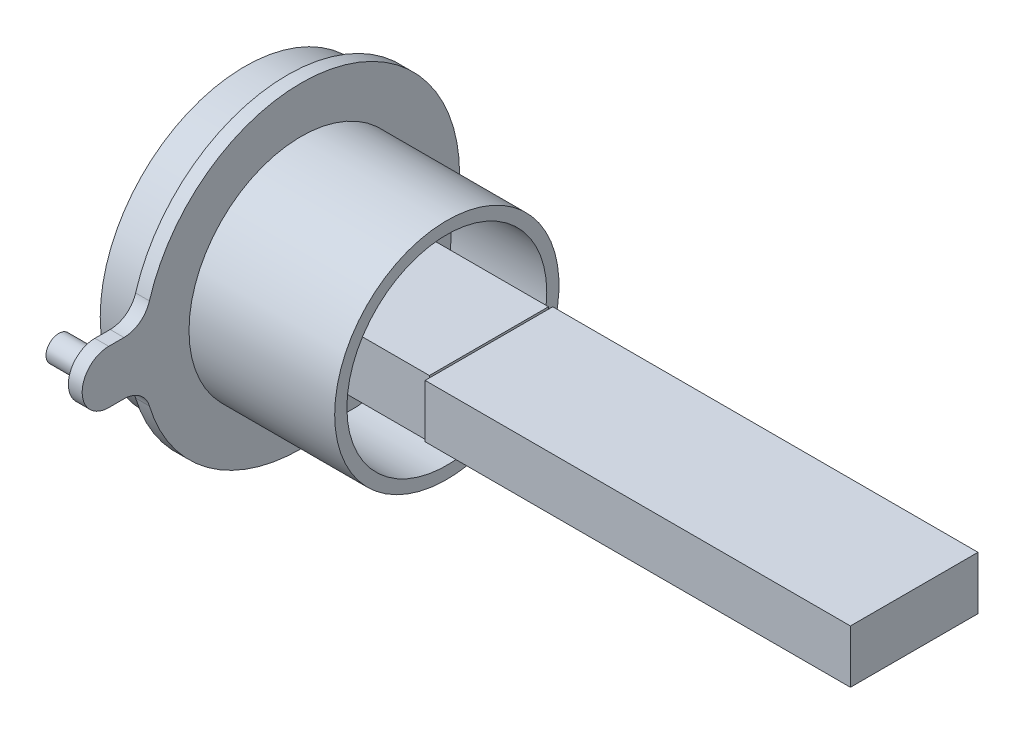
ISO-10303-21;
HEADER;
FILE_DESCRIPTION(('STEP AP214'),'2;1');
FILE_NAME('part.step','',(''),(''),'','','');
FILE_SCHEMA(('AUTOMOTIVE_DESIGN { 1 0 10303 214 1 1 1 1 }'));
ENDSEC;
DATA;
#1=APPLICATION_CONTEXT('core data for automotive mechanical design processes');
#2=APPLICATION_PROTOCOL_DEFINITION('international standard','automotive_design',2000,#1);
#3=PRODUCT_CONTEXT('',#1,'mechanical');
#4=PRODUCT('Part','Part','',(#3));
#5=PRODUCT_RELATED_PRODUCT_CATEGORY('part','',(#4));
#6=PRODUCT_DEFINITION_FORMATION('','',#4);
#7=PRODUCT_DEFINITION_CONTEXT('part definition',#1,'design');
#8=PRODUCT_DEFINITION('design','',#6,#7);
#9=PRODUCT_DEFINITION_SHAPE('','',#8);
#10=(LENGTH_UNIT() NAMED_UNIT(*) SI_UNIT(.MILLI.,.METRE.));
#11=(NAMED_UNIT(*) PLANE_ANGLE_UNIT() SI_UNIT($,.RADIAN.));
#12=(NAMED_UNIT(*) SI_UNIT($,.STERADIAN.) SOLID_ANGLE_UNIT());
#13=UNCERTAINTY_MEASURE_WITH_UNIT(LENGTH_MEASURE(1.E-05),#10,'distance_accuracy_value','');
#14=(GEOMETRIC_REPRESENTATION_CONTEXT(3) GLOBAL_UNCERTAINTY_ASSIGNED_CONTEXT((#13)) GLOBAL_UNIT_ASSIGNED_CONTEXT((#10,
#11,#12)) REPRESENTATION_CONTEXT('',''));
#15=CARTESIAN_POINT('',(0.,0.,0.));
#16=DIRECTION('',(0.,0.,1.));
#17=DIRECTION('',(1.,0.,0.));
#18=AXIS2_PLACEMENT_3D('',#15,#16,#17);
#19=CARTESIAN_POINT('',(22.4282,3.429,7.112));
#20=DIRECTION('',(-1.,0.,0.));
#21=DIRECTION('',(0.,0.,1.));
#22=AXIS2_PLACEMENT_3D('',#19,#20,#21);
#23=PLANE('',#22);
#24=DIRECTION('',(0.,0.,1.));
#25=VECTOR('',#24,1.);
#26=CARTESIAN_POINT('',(22.4282,3.175,7.62));
#27=LINE('',#26,#25);
#28=CARTESIAN_POINT('',(22.4282,3.175,-7.112));
#29=VERTEX_POINT('',#28);
#30=CARTESIAN_POINT('',(22.4282,3.175,7.112));
#31=VERTEX_POINT('',#30);
#32=EDGE_CURVE('E11',#29,#31,#27,.T.);
#33=ORIENTED_EDGE('',*,*,#32,.F.);
#34=DIRECTION('',(0.,1.,0.));
#35=VECTOR('',#34,1.);
#36=CARTESIAN_POINT('',(22.4282,3.429,-7.112));
#37=LINE('',#36,#35);
#38=CARTESIAN_POINT('',(22.4282,3.429,-7.112));
#39=VERTEX_POINT('',#38);
#40=EDGE_CURVE('E234',#29,#39,#37,.T.);
#41=ORIENTED_EDGE('',*,*,#40,.T.);
#42=DIRECTION('',(0.,0.,1.));
#43=VECTOR('',#42,1.);
#44=CARTESIAN_POINT('',(22.4282,3.429,7.112));
#45=LINE('',#44,#43);
#46=CARTESIAN_POINT('',(22.4282,3.429,7.112));
#47=VERTEX_POINT('',#46);
#48=EDGE_CURVE('E237',#39,#47,#45,.T.);
#49=ORIENTED_EDGE('',*,*,#48,.T.);
#50=DIRECTION('',(0.,-1.,0.));
#51=VECTOR('',#50,1.);
#52=CARTESIAN_POINT('',(22.4282,-3.429,7.112));
#53=LINE('',#52,#51);
#54=EDGE_CURVE('E228',#47,#31,#53,.T.);
#55=ORIENTED_EDGE('',*,*,#54,.T.);
#56=EDGE_LOOP('',(#33,#41,#49,#55));
#57=FACE_BOUND('',#56,.T.);
#58=ADVANCED_FACE('F34',(#57),#23,.F.);
#59=DIRECTION('',(0.,0.,-1.));
#60=VECTOR('',#59,1.);
#61=CARTESIAN_POINT('',(22.4282,-3.175,-7.62));
#62=LINE('',#61,#60);
#63=CARTESIAN_POINT('',(22.4282,-3.175,7.112));
#64=VERTEX_POINT('',#63);
#65=CARTESIAN_POINT('',(22.4282,-3.175,-7.112));
#66=VERTEX_POINT('',#65);
#67=EDGE_CURVE('E43',#64,#66,#62,.T.);
#68=ORIENTED_EDGE('',*,*,#67,.F.);
#69=CARTESIAN_POINT('',(22.4282,-3.429,7.112));
#70=VERTEX_POINT('',#69);
#71=EDGE_CURVE('E232',#64,#70,#53,.T.);
#72=ORIENTED_EDGE('',*,*,#71,.T.);
#73=DIRECTION('',(0.,0.,-1.));
#74=VECTOR('',#73,1.);
#75=CARTESIAN_POINT('',(22.4282,-3.429,-7.112));
#76=LINE('',#75,#74);
#77=CARTESIAN_POINT('',(22.4282,-3.429,-7.112));
#78=VERTEX_POINT('',#77);
#79=EDGE_CURVE('E230',#70,#78,#76,.T.);
#80=ORIENTED_EDGE('',*,*,#79,.T.);
#81=EDGE_CURVE('E235',#78,#66,#37,.T.);
#82=ORIENTED_EDGE('',*,*,#81,.T.);
#83=EDGE_LOOP('',(#68,#72,#80,#82));
#84=FACE_BOUND('',#83,.T.);
#85=ADVANCED_FACE('F389',(#84),#23,.F.);
#86=CARTESIAN_POINT('',(-1.651,18.923,0.));
#87=DIRECTION('',(1.,0.,0.));
#88=DIRECTION('',(0.,0.,-1.));
#89=AXIS2_PLACEMENT_3D('',#86,#87,#88);
#90=PLANE('',#89);
#91=DIRECTION('',(0.,0.,-1.));
#92=VECTOR('',#91,1.);
#93=CARTESIAN_POINT('',(-1.651,3.175,22.987));
#94=LINE('',#93,#92);
#95=CARTESIAN_POINT('',(-1.651,3.175,22.987));
#96=VERTEX_POINT('',#95);
#97=CARTESIAN_POINT('',(-1.651,3.175,21.1659893224957));
#98=VERTEX_POINT('',#97);
#99=EDGE_CURVE('E207',#96,#98,#94,.T.);
#100=ORIENTED_EDGE('',*,*,#99,.T.);
#101=CARTESIAN_POINT('',(-1.651,6.35,21.1659893224957));
#102=DIRECTION('',(1.,0.,0.));
#103=DIRECTION('',(0.,0.,-1.));
#104=AXIS2_PLACEMENT_3D('',#101,#102,#103);
#105=CIRCLE('',#104,3.175);
#106=CARTESIAN_POINT('',(-1.651,5.43764367816092,18.1248989025969));
#107=VERTEX_POINT('',#106);
#108=EDGE_CURVE('E336',#98,#107,#105,.T.);
#109=ORIENTED_EDGE('',*,*,#108,.T.);
#110=CARTESIAN_POINT('',(-1.651,0.,0.));
#111=DIRECTION('',(-1.,0.,0.));
#112=DIRECTION('',(0.,0.,1.));
#113=AXIS2_PLACEMENT_3D('',#110,#111,#112);
#114=CIRCLE('',#113,18.923);
#115=CARTESIAN_POINT('',(-1.651,-5.43764367816092,18.1248989025969));
#116=VERTEX_POINT('',#115);
#117=EDGE_CURVE('E320',#107,#116,#114,.T.);
#118=ORIENTED_EDGE('',*,*,#117,.T.);
#119=CARTESIAN_POINT('',(-1.651,-6.35,21.1659893224957));
#120=DIRECTION('',(1.,0.,0.));
#121=DIRECTION('',(0.,0.,-1.));
#122=AXIS2_PLACEMENT_3D('',#119,#120,#121);
#123=CIRCLE('',#122,3.175);
#124=CARTESIAN_POINT('',(-1.651,-3.175,21.1659893224957));
#125=VERTEX_POINT('',#124);
#126=EDGE_CURVE('E340',#116,#125,#123,.T.);
#127=ORIENTED_EDGE('',*,*,#126,.T.);
#128=DIRECTION('',(0.,0.,1.));
#129=VECTOR('',#128,1.);
#130=CARTESIAN_POINT('',(-1.651,-3.175,22.987));
#131=LINE('',#130,#129);
#132=CARTESIAN_POINT('',(-1.651,-3.175,22.987));
#133=VERTEX_POINT('',#132);
#134=EDGE_CURVE('E201',#125,#133,#131,.T.);
#135=ORIENTED_EDGE('',*,*,#134,.T.);
#136=CARTESIAN_POINT('',(-1.651,0.,22.987));
#137=DIRECTION('',(-1.,0.,0.));
#138=DIRECTION('',(0.,0.,1.));
#139=AXIS2_PLACEMENT_3D('',#136,#137,#138);
#140=CIRCLE('',#139,3.175);
#141=EDGE_CURVE('E211',#133,#96,#140,.T.);
#142=ORIENTED_EDGE('',*,*,#141,.T.);
#143=EDGE_LOOP('',(#100,#109,#118,#127,#135,#142));
#144=FACE_BOUND('',#143,.T.);
#145=CARTESIAN_POINT('',(-1.651,0.,0.));
#146=DIRECTION('',(-1.,0.,0.));
#147=DIRECTION('',(0.,0.,1.));
#148=AXIS2_PLACEMENT_3D('',#145,#146,#147);
#149=CIRCLE('',#148,17.272);
#150=CARTESIAN_POINT('',(-1.651,0.,17.272));
#151=VERTEX_POINT('',#150);
#152=EDGE_CURVE('E317',#151,#151,#149,.T.);
#153=ORIENTED_EDGE('',*,*,#152,.F.);
#154=EDGE_LOOP('',(#153));
#155=FACE_BOUND('',#154,.T.);
#156=CARTESIAN_POINT('',(-1.651,0.,22.987));
#157=DIRECTION('',(1.,0.,0.));
#158=DIRECTION('',(0.,0.,-1.));
#159=AXIS2_PLACEMENT_3D('',#156,#157,#158);
#160=CIRCLE('',#159,1.524);
#161=CARTESIAN_POINT('',(-1.651,0.,21.463));
#162=VERTEX_POINT('',#161);
#163=EDGE_CURVE('E38',#162,#162,#160,.F.);
#164=ORIENTED_EDGE('',*,*,#163,.F.);
#165=EDGE_LOOP('',(#164));
#166=FACE_BOUND('',#165,.T.);
#167=ADVANCED_FACE('F398',(#144,#155,#166),#90,.F.);
#168=CARTESIAN_POINT('',(5.969,11.938,0.));
#169=DIRECTION('',(-1.,0.,0.));
#170=DIRECTION('',(0.,0.,1.));
#171=AXIS2_PLACEMENT_3D('',#168,#169,#170);
#172=PLANE('',#171);
#173=CARTESIAN_POINT('',(5.969,0.,0.));
#174=DIRECTION('',(-1.,0.,0.));
#175=DIRECTION('',(0.,0.,1.));
#176=AXIS2_PLACEMENT_3D('',#173,#174,#175);
#177=CIRCLE('',#176,11.938);
#178=CARTESIAN_POINT('',(5.969,0.,11.938));
#179=VERTEX_POINT('',#178);
#180=EDGE_CURVE('E305',#179,#179,#177,.T.);
#181=ORIENTED_EDGE('',*,*,#180,.F.);
#182=EDGE_LOOP('',(#181));
#183=FACE_BOUND('',#182,.T.);
#184=DIRECTION('',(0.,-1.,0.));
#185=VECTOR('',#184,1.);
#186=CARTESIAN_POINT('',(5.969,-3.429,7.112));
#187=LINE('',#186,#185);
#188=CARTESIAN_POINT('',(5.969,3.429,7.112));
#189=VERTEX_POINT('',#188);
#190=CARTESIAN_POINT('',(5.969,-3.429,7.112));
#191=VERTEX_POINT('',#190);
#192=EDGE_CURVE('E220',#189,#191,#187,.T.);
#193=ORIENTED_EDGE('',*,*,#192,.F.);
#194=DIRECTION('',(0.,0.,1.));
#195=VECTOR('',#194,1.);
#196=CARTESIAN_POINT('',(5.969,3.429,7.112));
#197=LINE('',#196,#195);
#198=CARTESIAN_POINT('',(5.969,3.429,-7.112));
#199=VERTEX_POINT('',#198);
#200=EDGE_CURVE('E249',#199,#189,#197,.T.);
#201=ORIENTED_EDGE('',*,*,#200,.F.);
#202=DIRECTION('',(0.,1.,0.));
#203=VECTOR('',#202,1.);
#204=CARTESIAN_POINT('',(5.969,3.429,-7.112));
#205=LINE('',#204,#203);
#206=CARTESIAN_POINT('',(5.969,-3.429,-7.112));
#207=VERTEX_POINT('',#206);
#208=EDGE_CURVE('E246',#207,#199,#205,.T.);
#209=ORIENTED_EDGE('',*,*,#208,.F.);
#210=DIRECTION('',(0.,0.,-1.));
#211=VECTOR('',#210,1.);
#212=CARTESIAN_POINT('',(5.969,-3.429,-7.112));
#213=LINE('',#212,#211);
#214=EDGE_CURVE('E243',#191,#207,#213,.T.);
#215=ORIENTED_EDGE('',*,*,#214,.F.);
#216=EDGE_LOOP('',(#193,#201,#209,#215));
#217=FACE_BOUND('',#216,.T.);
#218=ADVANCED_FACE('F395',(#183,#217),#172,.F.);
#219=CARTESIAN_POINT('',(3.429,11.938,0.));
#220=DIRECTION('',(1.,0.,0.));
#221=DIRECTION('',(0.,0.,-1.));
#222=AXIS2_PLACEMENT_3D('',#219,#220,#221);
#223=PLANE('',#222);
#224=CARTESIAN_POINT('',(3.429,0.,0.));
#225=DIRECTION('',(-1.,0.,0.));
#226=DIRECTION('',(0.,0.,1.));
#227=AXIS2_PLACEMENT_3D('',#224,#225,#226);
#228=CIRCLE('',#227,11.938);
#229=CARTESIAN_POINT('',(3.429,0.,11.938));
#230=VERTEX_POINT('',#229);
#231=EDGE_CURVE('E308',#230,#230,#228,.T.);
#232=ORIENTED_EDGE('',*,*,#231,.T.);
#233=EDGE_LOOP('',(#232));
#234=FACE_BOUND('',#233,.T.);
#235=DIRECTION('',(0.,-1.,0.));
#236=VECTOR('',#235,1.);
#237=CARTESIAN_POINT('',(3.429,-5.334,-6.096));
#238=LINE('',#237,#236);
#239=CARTESIAN_POINT('',(3.429,5.334,-6.096));
#240=VERTEX_POINT('',#239);
#241=CARTESIAN_POINT('',(3.429,-5.334,-6.096));
#242=VERTEX_POINT('',#241);
#243=EDGE_CURVE('E263',#240,#242,#238,.T.);
#244=ORIENTED_EDGE('',*,*,#243,.F.);
#245=DIRECTION('',(0.,0.,-1.));
#246=VECTOR('',#245,1.);
#247=CARTESIAN_POINT('',(3.429,5.334,-6.096));
#248=LINE('',#247,#246);
#249=CARTESIAN_POINT('',(3.429,5.334,6.096));
#250=VERTEX_POINT('',#249);
#251=EDGE_CURVE('E268',#250,#240,#248,.T.);
#252=ORIENTED_EDGE('',*,*,#251,.F.);
#253=DIRECTION('',(0.,1.,0.));
#254=VECTOR('',#253,1.);
#255=CARTESIAN_POINT('',(3.429,5.334,6.096));
#256=LINE('',#255,#254);
#257=CARTESIAN_POINT('',(3.429,-5.334,6.096));
#258=VERTEX_POINT('',#257);
#259=EDGE_CURVE('E280',#258,#250,#256,.T.);
#260=ORIENTED_EDGE('',*,*,#259,.F.);
#261=DIRECTION('',(0.,0.,1.));
#262=VECTOR('',#261,1.);
#263=CARTESIAN_POINT('',(3.429,-5.334,6.096));
#264=LINE('',#263,#262);
#265=EDGE_CURVE('E277',#242,#258,#264,.T.);
#266=ORIENTED_EDGE('',*,*,#265,.F.);
#267=EDGE_LOOP('',(#244,#252,#260,#266));
#268=FACE_BOUND('',#267,.T.);
#269=ADVANCED_FACE('F397',(#234,#268),#223,.F.);
#270=CARTESIAN_POINT('',(0.,13.3985,0.));
#271=DIRECTION('',(-1.,0.,0.));
#272=DIRECTION('',(0.,0.,1.));
#273=AXIS2_PLACEMENT_3D('',#270,#271,#272);
#274=PLANE('',#273);
#275=CARTESIAN_POINT('',(0.,0.,0.));
#276=DIRECTION('',(-1.,0.,0.));
#277=DIRECTION('',(0.,0.,1.));
#278=AXIS2_PLACEMENT_3D('',#275,#276,#277);
#279=CIRCLE('',#278,18.923);
#280=CARTESIAN_POINT('',(0.,5.43764367816092,18.1248989025969));
#281=VERTEX_POINT('',#280);
#282=CARTESIAN_POINT('',(0.,-5.43764367816092,18.1248989025969));
#283=VERTEX_POINT('',#282);
#284=EDGE_CURVE('E323',#281,#283,#279,.T.);
#285=ORIENTED_EDGE('',*,*,#284,.F.);
#286=CARTESIAN_POINT('',(0.,6.35,21.1659893224957));
#287=DIRECTION('',(-1.,0.,0.));
#288=DIRECTION('',(0.,0.,1.));
#289=AXIS2_PLACEMENT_3D('',#286,#287,#288);
#290=CIRCLE('',#289,3.175);
#291=CARTESIAN_POINT('',(0.,3.175,21.1659893224957));
#292=VERTEX_POINT('',#291);
#293=EDGE_CURVE('E338',#281,#292,#290,.T.);
#294=ORIENTED_EDGE('',*,*,#293,.T.);
#295=DIRECTION('',(0.,0.,-1.));
#296=VECTOR('',#295,1.);
#297=CARTESIAN_POINT('',(0.,3.175,22.987));
#298=LINE('',#297,#296);
#299=CARTESIAN_POINT('',(0.,3.175,22.987));
#300=VERTEX_POINT('',#299);
#301=EDGE_CURVE('E217',#300,#292,#298,.T.);
#302=ORIENTED_EDGE('',*,*,#301,.F.);
#303=CARTESIAN_POINT('',(0.,0.,22.987));
#304=DIRECTION('',(1.,0.,0.));
#305=DIRECTION('',(0.,0.,-1.));
#306=AXIS2_PLACEMENT_3D('',#303,#304,#305);
#307=CIRCLE('',#306,3.175);
#308=CARTESIAN_POINT('',(0.,-3.175,22.987));
#309=VERTEX_POINT('',#308);
#310=EDGE_CURVE('E222',#309,#300,#307,.F.);
#311=ORIENTED_EDGE('',*,*,#310,.F.);
#312=DIRECTION('',(0.,0.,1.));
#313=VECTOR('',#312,1.);
#314=CARTESIAN_POINT('',(0.,-3.175,22.987));
#315=LINE('',#314,#313);
#316=CARTESIAN_POINT('',(0.,-3.175,21.1659893224957));
#317=VERTEX_POINT('',#316);
#318=EDGE_CURVE('E210',#317,#309,#315,.T.);
#319=ORIENTED_EDGE('',*,*,#318,.F.);
#320=CARTESIAN_POINT('',(0.,-6.35,21.1659893224957));
#321=DIRECTION('',(-1.,0.,0.));
#322=DIRECTION('',(0.,0.,1.));
#323=AXIS2_PLACEMENT_3D('',#320,#321,#322);
#324=CIRCLE('',#323,3.175);
#325=EDGE_CURVE('E341',#317,#283,#324,.T.);
#326=ORIENTED_EDGE('',*,*,#325,.T.);
#327=EDGE_LOOP('',(#285,#294,#302,#311,#319,#326));
#328=FACE_BOUND('',#327,.T.);
#329=CARTESIAN_POINT('',(0.,0.,0.));
#330=DIRECTION('',(-1.,0.,0.));
#331=DIRECTION('',(0.,0.,1.));
#332=AXIS2_PLACEMENT_3D('',#329,#330,#331);
#333=CIRCLE('',#332,13.3985);
#334=CARTESIAN_POINT('',(0.,0.,13.3985));
#335=VERTEX_POINT('',#334);
#336=EDGE_CURVE('E296',#335,#335,#333,.T.);
#337=ORIENTED_EDGE('',*,*,#336,.T.);
#338=EDGE_LOOP('',(#337));
#339=FACE_BOUND('',#338,.T.);
#340=ADVANCED_FACE('F405',(#328,#339),#274,.F.);
#341=CARTESIAN_POINT('',(-7.9375,0.,0.));
#342=DIRECTION('',(-1.,0.,0.));
#343=DIRECTION('',(0.,0.,1.));
#344=AXIS2_PLACEMENT_3D('',#341,#342,#343);
#345=CYLINDRICAL_SURFACE('',#344,18.923);
#346=ORIENTED_EDGE('',*,*,#117,.F.);
#347=DIRECTION('',(-1.,0.,0.));
#348=VECTOR('',#347,1.);
#349=CARTESIAN_POINT('',(-7.9375,5.43764367816092,18.1248989025969));
#350=LINE('',#349,#348);
#351=EDGE_CURVE('E332',#107,#281,#350,.F.);
#352=ORIENTED_EDGE('',*,*,#351,.T.);
#353=ORIENTED_EDGE('',*,*,#284,.T.);
#354=DIRECTION('',(-1.,0.,0.));
#355=VECTOR('',#354,1.);
#356=CARTESIAN_POINT('',(-7.9375,-5.43764367816092,18.1248989025969));
#357=LINE('',#356,#355);
#358=EDGE_CURVE('E329',#283,#116,#357,.T.);
#359=ORIENTED_EDGE('',*,*,#358,.T.);
#360=EDGE_LOOP('',(#346,#352,#353,#359));
#361=FACE_BOUND('',#360,.T.);
#362=ADVANCED_FACE('F479',(#361),#345,.T.);
#363=CARTESIAN_POINT('',(-7.9375,0.,0.));
#364=DIRECTION('',(-1.,0.,0.));
#365=DIRECTION('',(0.,0.,1.));
#366=AXIS2_PLACEMENT_3D('',#363,#364,#365);
#367=CYLINDRICAL_SURFACE('',#366,17.272);
#368=CARTESIAN_POINT('',(-6.731,0.,0.));
#369=DIRECTION('',(-1.,0.,0.));
#370=DIRECTION('',(0.,0.,1.));
#371=AXIS2_PLACEMENT_3D('',#368,#369,#370);
#372=CIRCLE('',#371,17.272);
#373=CARTESIAN_POINT('',(-6.731,0.,17.272));
#374=VERTEX_POINT('',#373);
#375=EDGE_CURVE('E314',#374,#374,#372,.T.);
#376=ORIENTED_EDGE('',*,*,#375,.F.);
#377=EDGE_LOOP('',(#376));
#378=FACE_BOUND('',#377,.T.);
#379=ORIENTED_EDGE('',*,*,#152,.T.);
#380=EDGE_LOOP('',(#379));
#381=FACE_BOUND('',#380,.T.);
#382=ADVANCED_FACE('F472',(#378,#381),#367,.T.);
#383=CARTESIAN_POINT('',(-6.731,17.272,0.));
#384=DIRECTION('',(1.,0.,0.));
#385=DIRECTION('',(0.,0.,-1.));
#386=AXIS2_PLACEMENT_3D('',#383,#384,#385);
#387=PLANE('',#386);
#388=CARTESIAN_POINT('',(-6.731,0.,0.));
#389=DIRECTION('',(-1.,0.,0.));
#390=DIRECTION('',(0.,0.,1.));
#391=AXIS2_PLACEMENT_3D('',#388,#389,#390);
#392=CIRCLE('',#391,11.938);
#393=CARTESIAN_POINT('',(-6.731,0.,11.938));
#394=VERTEX_POINT('',#393);
#395=EDGE_CURVE('E311',#394,#394,#392,.T.);
#396=ORIENTED_EDGE('',*,*,#395,.F.);
#397=EDGE_LOOP('',(#396));
#398=FACE_BOUND('',#397,.T.);
#399=ORIENTED_EDGE('',*,*,#375,.T.);
#400=EDGE_LOOP('',(#399));
#401=FACE_BOUND('',#400,.T.);
#402=ADVANCED_FACE('F463',(#398,#401),#387,.F.);
#403=CARTESIAN_POINT('',(-7.9375,0.,0.));
#404=DIRECTION('',(-1.,0.,0.));
#405=DIRECTION('',(0.,0.,1.));
#406=AXIS2_PLACEMENT_3D('',#403,#404,#405);
#407=CYLINDRICAL_SURFACE('',#406,11.938);
#408=ORIENTED_EDGE('',*,*,#231,.F.);
#409=EDGE_LOOP('',(#408));
#410=FACE_BOUND('',#409,.T.);
#411=ORIENTED_EDGE('',*,*,#395,.T.);
#412=EDGE_LOOP('',(#411));
#413=FACE_BOUND('',#412,.T.);
#414=ADVANCED_FACE('F458',(#410,#413),#407,.F.);
#415=CARTESIAN_POINT('',(-7.9375,0.,0.));
#416=DIRECTION('',(-1.,0.,0.));
#417=DIRECTION('',(0.,0.,1.));
#418=AXIS2_PLACEMENT_3D('',#415,#416,#417);
#419=CYLINDRICAL_SURFACE('',#418,11.938);
#420=CARTESIAN_POINT('',(17.399,0.,0.));
#421=DIRECTION('',(-1.,0.,0.));
#422=DIRECTION('',(0.,0.,1.));
#423=AXIS2_PLACEMENT_3D('',#420,#421,#422);
#424=CIRCLE('',#423,11.938);
#425=CARTESIAN_POINT('',(17.399,0.,11.938));
#426=VERTEX_POINT('',#425);
#427=EDGE_CURVE('E302',#426,#426,#424,.T.);
#428=ORIENTED_EDGE('',*,*,#427,.F.);
#429=EDGE_LOOP('',(#428));
#430=FACE_BOUND('',#429,.T.);
#431=ORIENTED_EDGE('',*,*,#180,.T.);
#432=EDGE_LOOP('',(#431));
#433=FACE_BOUND('',#432,.T.);
#434=ADVANCED_FACE('F455',(#430,#433),#419,.F.);
#435=CARTESIAN_POINT('',(17.399,13.3985,0.));
#436=DIRECTION('',(-1.,0.,0.));
#437=DIRECTION('',(0.,0.,1.));
#438=AXIS2_PLACEMENT_3D('',#435,#436,#437);
#439=PLANE('',#438);
#440=CARTESIAN_POINT('',(17.399,0.,0.));
#441=DIRECTION('',(-1.,0.,0.));
#442=DIRECTION('',(0.,0.,1.));
#443=AXIS2_PLACEMENT_3D('',#440,#441,#442);
#444=CIRCLE('',#443,13.3985);
#445=CARTESIAN_POINT('',(17.399,0.,13.3985));
#446=VERTEX_POINT('',#445);
#447=EDGE_CURVE('E299',#446,#446,#444,.T.);
#448=ORIENTED_EDGE('',*,*,#447,.F.);
#449=EDGE_LOOP('',(#448));
#450=FACE_BOUND('',#449,.T.);
#451=ORIENTED_EDGE('',*,*,#427,.T.);
#452=EDGE_LOOP('',(#451));
#453=FACE_BOUND('',#452,.T.);
#454=ADVANCED_FACE('F452',(#450,#453),#439,.F.);
#455=CARTESIAN_POINT('',(-7.9375,0.,0.));
#456=DIRECTION('',(-1.,0.,0.));
#457=DIRECTION('',(0.,0.,1.));
#458=AXIS2_PLACEMENT_3D('',#455,#456,#457);
#459=CYLINDRICAL_SURFACE('',#458,13.3985);
#460=ORIENTED_EDGE('',*,*,#336,.F.);
#461=EDGE_LOOP('',(#460));
#462=FACE_BOUND('',#461,.T.);
#463=ORIENTED_EDGE('',*,*,#447,.T.);
#464=EDGE_LOOP('',(#463));
#465=FACE_BOUND('',#464,.T.);
#466=ADVANCED_FACE('F448',(#462,#465),#459,.T.);
#467=CARTESIAN_POINT('',(-11.049,-5.334,-6.096));
#468=DIRECTION('',(0.,0.,1.));
#469=DIRECTION('',(1.,0.,0.));
#470=AXIS2_PLACEMENT_3D('',#467,#468,#469);
#471=PLANE('',#470);
#472=ORIENTED_EDGE('',*,*,#243,.T.);
#473=DIRECTION('',(1.,0.,0.));
#474=VECTOR('',#473,1.);
#475=CARTESIAN_POINT('',(-11.049,-5.334,-6.096));
#476=LINE('',#475,#474);
#477=CARTESIAN_POINT('',(-11.049,-5.334,-6.096));
#478=VERTEX_POINT('',#477);
#479=EDGE_CURVE('E293',#478,#242,#476,.T.);
#480=ORIENTED_EDGE('',*,*,#479,.F.);
#481=DIRECTION('',(0.,-1.,0.));
#482=VECTOR('',#481,1.);
#483=CARTESIAN_POINT('',(-11.049,-5.334,-6.096));
#484=LINE('',#483,#482);
#485=CARTESIAN_POINT('',(-11.049,5.334,-6.096));
#486=VERTEX_POINT('',#485);
#487=EDGE_CURVE('E264',#486,#478,#484,.T.);
#488=ORIENTED_EDGE('',*,*,#487,.F.);
#489=DIRECTION('',(1.,0.,0.));
#490=VECTOR('',#489,1.);
#491=CARTESIAN_POINT('',(-11.049,5.334,-6.096));
#492=LINE('',#491,#490);
#493=EDGE_CURVE('E274',#486,#240,#492,.T.);
#494=ORIENTED_EDGE('',*,*,#493,.T.);
#495=EDGE_LOOP('',(#472,#480,#488,#494));
#496=FACE_BOUND('',#495,.T.);
#497=ADVANCED_FACE('F444',(#496),#471,.F.);
#498=CARTESIAN_POINT('',(-11.049,-5.334,6.096));
#499=DIRECTION('',(0.,1.,0.));
#500=DIRECTION('',(0.,0.,1.));
#501=AXIS2_PLACEMENT_3D('',#498,#499,#500);
#502=PLANE('',#501);
#503=ORIENTED_EDGE('',*,*,#265,.T.);
#504=DIRECTION('',(1.,0.,0.));
#505=VECTOR('',#504,1.);
#506=CARTESIAN_POINT('',(-11.049,-5.334,6.096));
#507=LINE('',#506,#505);
#508=CARTESIAN_POINT('',(-11.049,-5.334,6.096));
#509=VERTEX_POINT('',#508);
#510=EDGE_CURVE('E290',#509,#258,#507,.T.);
#511=ORIENTED_EDGE('',*,*,#510,.F.);
#512=DIRECTION('',(0.,0.,1.));
#513=VECTOR('',#512,1.);
#514=CARTESIAN_POINT('',(-11.049,-5.334,6.096));
#515=LINE('',#514,#513);
#516=EDGE_CURVE('E267',#478,#509,#515,.T.);
#517=ORIENTED_EDGE('',*,*,#516,.F.);
#518=ORIENTED_EDGE('',*,*,#479,.T.);
#519=EDGE_LOOP('',(#503,#511,#517,#518));
#520=FACE_BOUND('',#519,.T.);
#521=ADVANCED_FACE('F440',(#520),#502,.F.);
#522=CARTESIAN_POINT('',(-11.049,5.334,6.096));
#523=DIRECTION('',(0.,0.,-1.));
#524=DIRECTION('',(-1.,0.,0.));
#525=AXIS2_PLACEMENT_3D('',#522,#523,#524);
#526=PLANE('',#525);
#527=ORIENTED_EDGE('',*,*,#259,.T.);
#528=DIRECTION('',(1.,0.,0.));
#529=VECTOR('',#528,1.);
#530=CARTESIAN_POINT('',(-11.049,5.334,6.096));
#531=LINE('',#530,#529);
#532=CARTESIAN_POINT('',(-11.049,5.334,6.096));
#533=VERTEX_POINT('',#532);
#534=EDGE_CURVE('E287',#533,#250,#531,.T.);
#535=ORIENTED_EDGE('',*,*,#534,.F.);
#536=DIRECTION('',(0.,1.,0.));
#537=VECTOR('',#536,1.);
#538=CARTESIAN_POINT('',(-11.049,5.334,6.096));
#539=LINE('',#538,#537);
#540=EDGE_CURVE('E270',#509,#533,#539,.T.);
#541=ORIENTED_EDGE('',*,*,#540,.F.);
#542=ORIENTED_EDGE('',*,*,#510,.T.);
#543=EDGE_LOOP('',(#527,#535,#541,#542));
#544=FACE_BOUND('',#543,.T.);
#545=ADVANCED_FACE('F436',(#544),#526,.F.);
#546=CARTESIAN_POINT('',(-11.049,5.334,-6.096));
#547=DIRECTION('',(0.,-1.,0.));
#548=DIRECTION('',(0.,0.,-1.));
#549=AXIS2_PLACEMENT_3D('',#546,#547,#548);
#550=PLANE('',#549);
#551=ORIENTED_EDGE('',*,*,#251,.T.);
#552=ORIENTED_EDGE('',*,*,#493,.F.);
#553=DIRECTION('',(0.,0.,-1.));
#554=VECTOR('',#553,1.);
#555=CARTESIAN_POINT('',(-11.049,5.334,-6.096));
#556=LINE('',#555,#554);
#557=EDGE_CURVE('E272',#533,#486,#556,.T.);
#558=ORIENTED_EDGE('',*,*,#557,.F.);
#559=ORIENTED_EDGE('',*,*,#534,.T.);
#560=EDGE_LOOP('',(#551,#552,#558,#559));
#561=FACE_BOUND('',#560,.T.);
#562=ADVANCED_FACE('F432',(#561),#550,.F.);
#563=CARTESIAN_POINT('',(-11.049,5.334,-6.096));
#564=DIRECTION('',(1.,0.,0.));
#565=DIRECTION('',(0.,0.,-1.));
#566=AXIS2_PLACEMENT_3D('',#563,#564,#565);
#567=PLANE('',#566);
#568=ORIENTED_EDGE('',*,*,#487,.T.);
#569=ORIENTED_EDGE('',*,*,#516,.T.);
#570=ORIENTED_EDGE('',*,*,#540,.T.);
#571=ORIENTED_EDGE('',*,*,#557,.T.);
#572=EDGE_LOOP('',(#568,#569,#570,#571));
#573=FACE_BOUND('',#572,.T.);
#574=ADVANCED_FACE('F429',(#573),#567,.F.);
#575=CARTESIAN_POINT('',(22.4282,-3.429,7.112));
#576=DIRECTION('',(0.,0.,-1.));
#577=DIRECTION('',(-1.,0.,0.));
#578=AXIS2_PLACEMENT_3D('',#575,#576,#577);
#579=PLANE('',#578);
#580=ORIENTED_EDGE('',*,*,#192,.T.);
#581=DIRECTION('',(-1.,0.,0.));
#582=VECTOR('',#581,1.);
#583=CARTESIAN_POINT('',(22.4282,-3.429,7.112));
#584=LINE('',#583,#582);
#585=EDGE_CURVE('E260',#70,#191,#584,.T.);
#586=ORIENTED_EDGE('',*,*,#585,.F.);
#587=ORIENTED_EDGE('',*,*,#71,.F.);
#588=EDGE_CURVE('E231',#31,#64,#53,.T.);
#589=ORIENTED_EDGE('',*,*,#588,.F.);
#590=ORIENTED_EDGE('',*,*,#54,.F.);
#591=DIRECTION('',(-1.,0.,0.));
#592=VECTOR('',#591,1.);
#593=CARTESIAN_POINT('',(22.4282,3.429,7.112));
#594=LINE('',#593,#592);
#595=EDGE_CURVE('E240',#47,#189,#594,.T.);
#596=ORIENTED_EDGE('',*,*,#595,.T.);
#597=EDGE_LOOP('',(#580,#586,#587,#589,#590,#596));
#598=FACE_BOUND('',#597,.T.);
#599=ADVANCED_FACE('F384',(#598),#579,.F.);
#600=CARTESIAN_POINT('',(22.4282,-3.429,-7.112));
#601=DIRECTION('',(0.,1.,0.));
#602=DIRECTION('',(0.,0.,1.));
#603=AXIS2_PLACEMENT_3D('',#600,#601,#602);
#604=PLANE('',#603);
#605=ORIENTED_EDGE('',*,*,#214,.T.);
#606=DIRECTION('',(-1.,0.,0.));
#607=VECTOR('',#606,1.);
#608=CARTESIAN_POINT('',(22.4282,-3.429,-7.112));
#609=LINE('',#608,#607);
#610=EDGE_CURVE('E257',#78,#207,#609,.T.);
#611=ORIENTED_EDGE('',*,*,#610,.F.);
#612=ORIENTED_EDGE('',*,*,#79,.F.);
#613=ORIENTED_EDGE('',*,*,#585,.T.);
#614=EDGE_LOOP('',(#605,#611,#612,#613));
#615=FACE_BOUND('',#614,.T.);
#616=ADVANCED_FACE('F393',(#615),#604,.F.);
#617=CARTESIAN_POINT('',(22.4282,3.429,-7.112));
#618=DIRECTION('',(0.,0.,1.));
#619=DIRECTION('',(1.,0.,0.));
#620=AXIS2_PLACEMENT_3D('',#617,#618,#619);
#621=PLANE('',#620);
#622=ORIENTED_EDGE('',*,*,#208,.T.);
#623=DIRECTION('',(-1.,0.,0.));
#624=VECTOR('',#623,1.);
#625=CARTESIAN_POINT('',(22.4282,3.429,-7.112));
#626=LINE('',#625,#624);
#627=EDGE_CURVE('E254',#39,#199,#626,.T.);
#628=ORIENTED_EDGE('',*,*,#627,.F.);
#629=ORIENTED_EDGE('',*,*,#40,.F.);
#630=EDGE_CURVE('E238',#66,#29,#37,.T.);
#631=ORIENTED_EDGE('',*,*,#630,.F.);
#632=ORIENTED_EDGE('',*,*,#81,.F.);
#633=ORIENTED_EDGE('',*,*,#610,.T.);
#634=EDGE_LOOP('',(#622,#628,#629,#631,#632,#633));
#635=FACE_BOUND('',#634,.T.);
#636=ADVANCED_FACE('F379',(#635),#621,.F.);
#637=CARTESIAN_POINT('',(22.4282,3.429,7.112));
#638=DIRECTION('',(0.,-1.,0.));
#639=DIRECTION('',(0.,0.,-1.));
#640=AXIS2_PLACEMENT_3D('',#637,#638,#639);
#641=PLANE('',#640);
#642=ORIENTED_EDGE('',*,*,#200,.T.);
#643=ORIENTED_EDGE('',*,*,#595,.F.);
#644=ORIENTED_EDGE('',*,*,#48,.F.);
#645=ORIENTED_EDGE('',*,*,#627,.T.);
#646=EDGE_LOOP('',(#642,#643,#644,#645));
#647=FACE_BOUND('',#646,.T.);
#648=ADVANCED_FACE('F381',(#647),#641,.F.);
#649=CARTESIAN_POINT('',(9.83267313320304,-3.175,22.987));
#650=DIRECTION('',(0.,-1.,0.));
#651=DIRECTION('',(0.,0.,-1.));
#652=AXIS2_PLACEMENT_3D('',#649,#650,#651);
#653=PLANE('',#652);
#654=ORIENTED_EDGE('',*,*,#134,.F.);
#655=DIRECTION('',(-1.,0.,0.));
#656=VECTOR('',#655,1.);
#657=CARTESIAN_POINT('',(9.83267313320304,-3.175,21.1659893224957));
#658=LINE('',#657,#656);
#659=EDGE_CURVE('E334',#125,#317,#658,.F.);
#660=ORIENTED_EDGE('',*,*,#659,.T.);
#661=ORIENTED_EDGE('',*,*,#318,.T.);
#662=DIRECTION('',(-1.,0.,0.));
#663=VECTOR('',#662,1.);
#664=CARTESIAN_POINT('',(9.83267313320304,-3.175,22.987));
#665=LINE('',#664,#663);
#666=EDGE_CURVE('E216',#309,#133,#665,.T.);
#667=ORIENTED_EDGE('',*,*,#666,.T.);
#668=EDGE_LOOP('',(#654,#660,#661,#667));
#669=FACE_BOUND('',#668,.T.);
#670=ADVANCED_FACE('F419',(#669),#653,.T.);
#671=CARTESIAN_POINT('',(9.83267313320304,0.,22.987));
#672=DIRECTION('',(-1.,0.,0.));
#673=DIRECTION('',(0.,0.,1.));
#674=AXIS2_PLACEMENT_3D('',#671,#672,#673);
#675=CYLINDRICAL_SURFACE('',#674,3.175);
#676=ORIENTED_EDGE('',*,*,#666,.F.);
#677=ORIENTED_EDGE('',*,*,#310,.T.);
#678=DIRECTION('',(-1.,0.,0.));
#679=VECTOR('',#678,1.);
#680=CARTESIAN_POINT('',(9.83267313320304,3.175,22.987));
#681=LINE('',#680,#679);
#682=EDGE_CURVE('E221',#300,#96,#681,.T.);
#683=ORIENTED_EDGE('',*,*,#682,.T.);
#684=ORIENTED_EDGE('',*,*,#141,.F.);
#685=EDGE_LOOP('',(#676,#677,#683,#684));
#686=FACE_BOUND('',#685,.T.);
#687=ADVANCED_FACE('F496',(#686),#675,.T.);
#688=CARTESIAN_POINT('',(9.83267313320304,3.175,22.987));
#689=DIRECTION('',(0.,1.,0.));
#690=DIRECTION('',(0.,0.,1.));
#691=AXIS2_PLACEMENT_3D('',#688,#689,#690);
#692=PLANE('',#691);
#693=ORIENTED_EDGE('',*,*,#301,.T.);
#694=DIRECTION('',(-1.,0.,0.));
#695=VECTOR('',#694,1.);
#696=CARTESIAN_POINT('',(9.83267313320304,3.175,21.1659893224957));
#697=LINE('',#696,#695);
#698=EDGE_CURVE('E326',#292,#98,#697,.T.);
#699=ORIENTED_EDGE('',*,*,#698,.T.);
#700=ORIENTED_EDGE('',*,*,#99,.F.);
#701=ORIENTED_EDGE('',*,*,#682,.F.);
#702=EDGE_LOOP('',(#693,#699,#700,#701));
#703=FACE_BOUND('',#702,.T.);
#704=ADVANCED_FACE('F488',(#703),#692,.T.);
#705=CARTESIAN_POINT('',(-7.9375,6.35,21.1659893224957));
#706=DIRECTION('',(-1.,0.,0.));
#707=DIRECTION('',(0.,0.,1.));
#708=AXIS2_PLACEMENT_3D('',#705,#706,#707);
#709=CYLINDRICAL_SURFACE('',#708,3.175);
#710=ORIENTED_EDGE('',*,*,#293,.F.);
#711=ORIENTED_EDGE('',*,*,#351,.F.);
#712=ORIENTED_EDGE('',*,*,#108,.F.);
#713=ORIENTED_EDGE('',*,*,#698,.F.);
#714=EDGE_LOOP('',(#710,#711,#712,#713));
#715=FACE_BOUND('',#714,.T.);
#716=ADVANCED_FACE('F486',(#715),#709,.F.);
#717=CARTESIAN_POINT('',(-7.9375,-6.35,21.1659893224957));
#718=DIRECTION('',(-1.,0.,0.));
#719=DIRECTION('',(0.,0.,1.));
#720=AXIS2_PLACEMENT_3D('',#717,#718,#719);
#721=CYLINDRICAL_SURFACE('',#720,3.175);
#722=ORIENTED_EDGE('',*,*,#325,.F.);
#723=ORIENTED_EDGE('',*,*,#659,.F.);
#724=ORIENTED_EDGE('',*,*,#126,.F.);
#725=ORIENTED_EDGE('',*,*,#358,.F.);
#726=EDGE_LOOP('',(#722,#723,#724,#725));
#727=FACE_BOUND('',#726,.T.);
#728=ADVANCED_FACE('F36',(#727),#721,.F.);
#729=CARTESIAN_POINT('',(-5.969,0.,22.987));
#730=DIRECTION('',(1.,0.,0.));
#731=DIRECTION('',(0.,0.,-1.));
#732=AXIS2_PLACEMENT_3D('',#729,#730,#731);
#733=CYLINDRICAL_SURFACE('',#732,1.524);
#734=CARTESIAN_POINT('',(-5.969,0.,22.987));
#735=DIRECTION('',(-1.,0.,0.));
#736=DIRECTION('',(0.,0.,1.));
#737=AXIS2_PLACEMENT_3D('',#734,#735,#736);
#738=CIRCLE('',#737,1.524);
#739=CARTESIAN_POINT('',(-5.969,0.,24.511));
#740=VERTEX_POINT('',#739);
#741=EDGE_CURVE('E198',#740,#740,#738,.T.);
#742=ORIENTED_EDGE('',*,*,#741,.F.);
#743=EDGE_LOOP('',(#742));
#744=FACE_BOUND('',#743,.T.);
#745=ORIENTED_EDGE('',*,*,#163,.T.);
#746=EDGE_LOOP('',(#745));
#747=FACE_BOUND('',#746,.T.);
#748=ADVANCED_FACE('F494',(#744,#747),#733,.T.);
#749=CARTESIAN_POINT('',(-5.969,0.,22.987));
#750=DIRECTION('',(-1.,0.,0.));
#751=DIRECTION('',(0.,0.,1.));
#752=AXIS2_PLACEMENT_3D('',#749,#750,#751);
#753=PLANE('',#752);
#754=ORIENTED_EDGE('',*,*,#741,.T.);
#755=EDGE_LOOP('',(#754));
#756=FACE_BOUND('',#755,.T.);
#757=ADVANCED_FACE('F524',(#756),#753,.T.);
#758=CARTESIAN_POINT('',(22.4282,3.175,7.62));
#759=DIRECTION('',(-1.,0.,0.));
#760=DIRECTION('',(0.,0.,1.));
#761=AXIS2_PLACEMENT_3D('',#758,#759,#760);
#762=PLANE('',#761);
#763=CARTESIAN_POINT('',(22.4282,3.175,7.62));
#764=VERTEX_POINT('',#763);
#765=EDGE_CURVE('E46',#31,#764,#27,.T.);
#766=ORIENTED_EDGE('',*,*,#765,.F.);
#767=ORIENTED_EDGE('',*,*,#588,.T.);
#768=CARTESIAN_POINT('',(22.4282,-3.175,7.62));
#769=VERTEX_POINT('',#768);
#770=EDGE_CURVE('E350',#769,#64,#62,.T.);
#771=ORIENTED_EDGE('',*,*,#770,.F.);
#772=DIRECTION('',(0.,-1.,0.));
#773=VECTOR('',#772,1.);
#774=CARTESIAN_POINT('',(22.4282,-3.175,7.62));
#775=LINE('',#774,#773);
#776=EDGE_CURVE('E197',#764,#769,#775,.T.);
#777=ORIENTED_EDGE('',*,*,#776,.F.);
#778=EDGE_LOOP('',(#766,#767,#771,#777));
#779=FACE_BOUND('',#778,.T.);
#780=ADVANCED_FACE('F387',(#779),#762,.T.);
#781=CARTESIAN_POINT('',(73.2282,-3.175,7.62));
#782=DIRECTION('',(0.,0.,-1.));
#783=DIRECTION('',(-1.,0.,0.));
#784=AXIS2_PLACEMENT_3D('',#781,#782,#783);
#785=PLANE('',#784);
#786=ORIENTED_EDGE('',*,*,#776,.T.);
#787=DIRECTION('',(-1.,0.,0.));
#788=VECTOR('',#787,1.);
#789=CARTESIAN_POINT('',(73.2282,-3.175,7.62));
#790=LINE('',#789,#788);
#791=CARTESIAN_POINT('',(73.2282,-3.175,7.62));
#792=VERTEX_POINT('',#791);
#793=EDGE_CURVE('E178',#792,#769,#790,.T.);
#794=ORIENTED_EDGE('',*,*,#793,.F.);
#795=DIRECTION('',(0.,-1.,0.));
#796=VECTOR('',#795,1.);
#797=CARTESIAN_POINT('',(73.2282,-3.175,7.62));
#798=LINE('',#797,#796);
#799=CARTESIAN_POINT('',(73.2282,3.175,7.62));
#800=VERTEX_POINT('',#799);
#801=EDGE_CURVE('E185',#800,#792,#798,.T.);
#802=ORIENTED_EDGE('',*,*,#801,.F.);
#803=DIRECTION('',(-1.,0.,0.));
#804=VECTOR('',#803,1.);
#805=CARTESIAN_POINT('',(73.2282,3.175,7.62));
#806=LINE('',#805,#804);
#807=EDGE_CURVE('E358',#800,#764,#806,.T.);
#808=ORIENTED_EDGE('',*,*,#807,.T.);
#809=EDGE_LOOP('',(#786,#794,#802,#808));
#810=FACE_BOUND('',#809,.T.);
#811=ADVANCED_FACE('F195',(#810),#785,.F.);
#812=CARTESIAN_POINT('',(73.2282,-3.175,-7.62));
#813=DIRECTION('',(0.,1.,0.));
#814=DIRECTION('',(0.,0.,1.));
#815=AXIS2_PLACEMENT_3D('',#812,#813,#814);
#816=PLANE('',#815);
#817=ORIENTED_EDGE('',*,*,#770,.T.);
#818=ORIENTED_EDGE('',*,*,#67,.T.);
#819=CARTESIAN_POINT('',(22.4282,-3.175,-7.62));
#820=VERTEX_POINT('',#819);
#821=EDGE_CURVE('E351',#66,#820,#62,.T.);
#822=ORIENTED_EDGE('',*,*,#821,.T.);
#823=DIRECTION('',(-1.,0.,0.));
#824=VECTOR('',#823,1.);
#825=CARTESIAN_POINT('',(73.2282,-3.175,-7.62));
#826=LINE('',#825,#824);
#827=CARTESIAN_POINT('',(73.2282,-3.175,-7.62));
#828=VERTEX_POINT('',#827);
#829=EDGE_CURVE('E181',#828,#820,#826,.T.);
#830=ORIENTED_EDGE('',*,*,#829,.F.);
#831=DIRECTION('',(0.,0.,-1.));
#832=VECTOR('',#831,1.);
#833=CARTESIAN_POINT('',(73.2282,-3.175,-7.62));
#834=LINE('',#833,#832);
#835=EDGE_CURVE('E173',#792,#828,#834,.T.);
#836=ORIENTED_EDGE('',*,*,#835,.F.);
#837=ORIENTED_EDGE('',*,*,#793,.T.);
#838=EDGE_LOOP('',(#817,#818,#822,#830,#836,#837));
#839=FACE_BOUND('',#838,.T.);
#840=ADVANCED_FACE('F176',(#839),#816,.F.);
#841=CARTESIAN_POINT('',(73.2282,3.175,-7.62));
#842=DIRECTION('',(0.,0.,1.));
#843=DIRECTION('',(1.,0.,0.));
#844=AXIS2_PLACEMENT_3D('',#841,#842,#843);
#845=PLANE('',#844);
#846=DIRECTION('',(0.,1.,0.));
#847=VECTOR('',#846,1.);
#848=CARTESIAN_POINT('',(22.4282,3.175,-7.62));
#849=LINE('',#848,#847);
#850=CARTESIAN_POINT('',(22.4282,3.175,-7.62));
#851=VERTEX_POINT('',#850);
#852=EDGE_CURVE('E354',#820,#851,#849,.T.);
#853=ORIENTED_EDGE('',*,*,#852,.T.);
#854=DIRECTION('',(-1.,0.,0.));
#855=VECTOR('',#854,1.);
#856=CARTESIAN_POINT('',(73.2282,3.175,-7.62));
#857=LINE('',#856,#855);
#858=CARTESIAN_POINT('',(73.2282,3.175,-7.62));
#859=VERTEX_POINT('',#858);
#860=EDGE_CURVE('E203',#859,#851,#857,.T.);
#861=ORIENTED_EDGE('',*,*,#860,.F.);
#862=DIRECTION('',(0.,1.,0.));
#863=VECTOR('',#862,1.);
#864=CARTESIAN_POINT('',(73.2282,3.175,-7.62));
#865=LINE('',#864,#863);
#866=EDGE_CURVE('E184',#828,#859,#865,.T.);
#867=ORIENTED_EDGE('',*,*,#866,.F.);
#868=ORIENTED_EDGE('',*,*,#829,.T.);
#869=EDGE_LOOP('',(#853,#861,#867,#868));
#870=FACE_BOUND('',#869,.T.);
#871=ADVANCED_FACE('F362',(#870),#845,.F.);
#872=CARTESIAN_POINT('',(73.2282,3.175,7.62));
#873=DIRECTION('',(0.,-1.,0.));
#874=DIRECTION('',(0.,0.,-1.));
#875=AXIS2_PLACEMENT_3D('',#872,#873,#874);
#876=PLANE('',#875);
#877=EDGE_CURVE('E45',#851,#29,#27,.T.);
#878=ORIENTED_EDGE('',*,*,#877,.T.);
#879=ORIENTED_EDGE('',*,*,#32,.T.);
#880=ORIENTED_EDGE('',*,*,#765,.T.);
#881=ORIENTED_EDGE('',*,*,#807,.F.);
#882=DIRECTION('',(0.,0.,1.));
#883=VECTOR('',#882,1.);
#884=CARTESIAN_POINT('',(73.2282,3.175,7.62));
#885=LINE('',#884,#883);
#886=EDGE_CURVE('E190',#859,#800,#885,.T.);
#887=ORIENTED_EDGE('',*,*,#886,.F.);
#888=ORIENTED_EDGE('',*,*,#860,.T.);
#889=EDGE_LOOP('',(#878,#879,#880,#881,#887,#888));
#890=FACE_BOUND('',#889,.T.);
#891=ADVANCED_FACE('F367',(#890),#876,.F.);
#892=CARTESIAN_POINT('',(73.2282,3.175,7.62));
#893=DIRECTION('',(-1.,0.,0.));
#894=DIRECTION('',(0.,0.,1.));
#895=AXIS2_PLACEMENT_3D('',#892,#893,#894);
#896=PLANE('',#895);
#897=ORIENTED_EDGE('',*,*,#801,.T.);
#898=ORIENTED_EDGE('',*,*,#835,.T.);
#899=ORIENTED_EDGE('',*,*,#866,.T.);
#900=ORIENTED_EDGE('',*,*,#886,.T.);
#901=EDGE_LOOP('',(#897,#898,#899,#900));
#902=FACE_BOUND('',#901,.T.);
#903=ADVANCED_FACE('F188',(#902),#896,.F.);
#904=ORIENTED_EDGE('',*,*,#821,.F.);
#905=ORIENTED_EDGE('',*,*,#630,.T.);
#906=ORIENTED_EDGE('',*,*,#877,.F.);
#907=ORIENTED_EDGE('',*,*,#852,.F.);
#908=EDGE_LOOP('',(#904,#905,#906,#907));
#909=FACE_BOUND('',#908,.T.);
#910=ADVANCED_FACE('F372',(#909),#762,.T.);
#911=CLOSED_SHELL('',(#58,#85,#167,#218,#269,#340,#362,#382,#402,#414,#434,#454,#466,#497,#521,
#545,#562,#574,#599,#616,#636,#648,#670,#687,#704,#716,#728,#748,#757,#780,#811,#840,#871,#891,
#903,#910));
#912=MANIFOLD_SOLID_BREP('B2',#911);
#913=ADVANCED_BREP_SHAPE_REPRESENTATION('',(#18,#912),#14);
#914=SHAPE_DEFINITION_REPRESENTATION(#9,#913);
ENDSEC;
END-ISO-10303-21;
